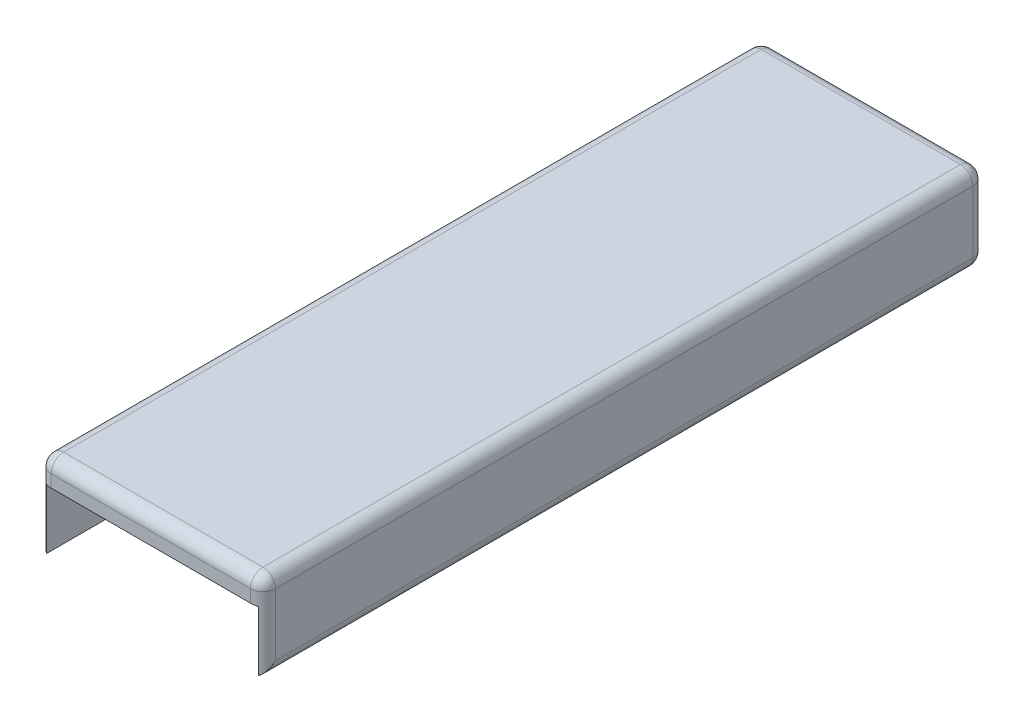
ISO-10303-21;
HEADER;
FILE_DESCRIPTION(('STEP AP214'),'2;1');
FILE_NAME('part.step','',(''),(''),'','','');
FILE_SCHEMA(('AUTOMOTIVE_DESIGN { 1 0 10303 214 1 1 1 1 }'));
ENDSEC;
DATA;
#1=APPLICATION_CONTEXT('core data for automotive mechanical design processes');
#2=APPLICATION_PROTOCOL_DEFINITION('international standard','automotive_design',2000,#1);
#3=PRODUCT_CONTEXT('',#1,'mechanical');
#4=PRODUCT('Part','Part','',(#3));
#5=PRODUCT_RELATED_PRODUCT_CATEGORY('part','',(#4));
#6=PRODUCT_DEFINITION_FORMATION('','',#4);
#7=PRODUCT_DEFINITION_CONTEXT('part definition',#1,'design');
#8=PRODUCT_DEFINITION('design','',#6,#7);
#9=PRODUCT_DEFINITION_SHAPE('','',#8);
#10=(LENGTH_UNIT() NAMED_UNIT(*) SI_UNIT(.MILLI.,.METRE.));
#11=(NAMED_UNIT(*) PLANE_ANGLE_UNIT() SI_UNIT($,.RADIAN.));
#12=(NAMED_UNIT(*) SI_UNIT($,.STERADIAN.) SOLID_ANGLE_UNIT());
#13=UNCERTAINTY_MEASURE_WITH_UNIT(LENGTH_MEASURE(1.E-05),#10,'distance_accuracy_value','');
#14=(GEOMETRIC_REPRESENTATION_CONTEXT(3) GLOBAL_UNCERTAINTY_ASSIGNED_CONTEXT((#13)) GLOBAL_UNIT_ASSIGNED_CONTEXT((#10,
#11,#12)) REPRESENTATION_CONTEXT('',''));
#15=CARTESIAN_POINT('',(0.,0.,0.));
#16=DIRECTION('',(0.,0.,1.));
#17=DIRECTION('',(1.,0.,0.));
#18=AXIS2_PLACEMENT_3D('',#15,#16,#17);
#19=CARTESIAN_POINT('',(-8.5,21.8847763108502,22.));
#20=DIRECTION('',(0.,0.,-1.));
#21=DIRECTION('',(-1.,0.,0.));
#22=AXIS2_PLACEMENT_3D('',#19,#20,#21);
#23=PLANE('',#22);
#24=DIRECTION('',(0.,1.,0.));
#25=VECTOR('',#24,1.);
#26=CARTESIAN_POINT('',(0.,-3.5,22.));
#27=LINE('',#26,#25);
#28=CARTESIAN_POINT('',(0.,-3.5,22.));
#29=VERTEX_POINT('',#28);
#30=CARTESIAN_POINT('',(0.,-1.49999999999999,22.));
#31=VERTEX_POINT('',#30);
#32=EDGE_CURVE('E64',#29,#31,#27,.T.);
#33=ORIENTED_EDGE('',*,*,#32,.F.);
#34=DIRECTION('',(1.,0.,0.));
#35=VECTOR('',#34,1.);
#36=CARTESIAN_POINT('',(-8.5,-3.5,22.));
#37=LINE('',#36,#35);
#38=CARTESIAN_POINT('',(8.,-3.5,22.));
#39=VERTEX_POINT('',#38);
#40=EDGE_CURVE('E224',#29,#39,#37,.T.);
#41=ORIENTED_EDGE('',*,*,#40,.T.);
#42=CARTESIAN_POINT('',(8.,-2.5,22.));
#43=DIRECTION('',(0.,0.,-1.));
#44=DIRECTION('',(-1.,0.,0.));
#45=AXIS2_PLACEMENT_3D('',#42,#43,#44);
#46=CIRCLE('',#45,1.);
#47=CARTESIAN_POINT('',(8.5,-3.36602540378444,22.));
#48=VERTEX_POINT('',#47);
#49=EDGE_CURVE('E277',#39,#48,#46,.F.);
#50=ORIENTED_EDGE('',*,*,#49,.T.);
#51=DIRECTION('',(0.,-1.,0.));
#52=VECTOR('',#51,1.);
#53=CARTESIAN_POINT('',(8.5,21.8847763108502,22.));
#54=LINE('',#53,#52);
#55=CARTESIAN_POINT('',(8.5,-1.49999999999999,22.));
#56=VERTEX_POINT('',#55);
#57=EDGE_CURVE('E223',#56,#48,#54,.T.);
#58=ORIENTED_EDGE('',*,*,#57,.F.);
#59=DIRECTION('',(-1.,0.,0.));
#60=VECTOR('',#59,1.);
#61=CARTESIAN_POINT('',(-8.5,-1.49999999999999,22.));
#62=LINE('',#61,#60);
#63=EDGE_CURVE('E222',#56,#31,#62,.T.);
#64=ORIENTED_EDGE('',*,*,#63,.T.);
#65=EDGE_LOOP('',(#33,#41,#50,#58,#64));
#66=FACE_BOUND('',#65,.T.);
#67=ADVANCED_FACE('F49',(#66),#23,.F.);
#68=CARTESIAN_POINT('',(-8.5,-1.49999999999999,22.));
#69=DIRECTION('',(0.,0.919145030018057,-0.39391929857917));
#70=DIRECTION('',(-1.,0.,0.));
#71=AXIS2_PLACEMENT_3D('',#68,#69,#70);
#72=PLANE('',#71);
#73=DIRECTION('',(0.,0.39391929857917,0.919145030018057));
#74=VECTOR('',#73,1.);
#75=CARTESIAN_POINT('',(0.,-1.49999999999999,22.));
#76=LINE('',#75,#74);
#77=CARTESIAN_POINT('',(0.,-1.45714285714285,22.1));
#78=VERTEX_POINT('',#77);
#79=EDGE_CURVE('E12',#31,#78,#76,.T.);
#80=ORIENTED_EDGE('',*,*,#79,.F.);
#81=ORIENTED_EDGE('',*,*,#63,.F.);
#82=DIRECTION('',(0.,-0.39391929857917,-0.919145030018057));
#83=VECTOR('',#82,1.);
#84=CARTESIAN_POINT('',(8.5,-1.5,22.));
#85=LINE('',#84,#83);
#86=CARTESIAN_POINT('',(8.5,1.44258231590764,28.8660254037844));
#87=VERTEX_POINT('',#86);
#88=EDGE_CURVE('E232',#87,#56,#85,.T.);
#89=ORIENTED_EDGE('',*,*,#88,.F.);
#90=CARTESIAN_POINT('',(8.,1.0714285714286,28.));
#91=DIRECTION('',(0.,0.919145030018057,-0.39391929857917));
#92=DIRECTION('',(0.,-0.39391929857917,-0.919145030018057));
#93=AXIS2_PLACEMENT_3D('',#90,#91,#92);
#94=ELLIPSE('',#93,1.08796758655199,1.);
#95=CARTESIAN_POINT('',(8.,1.5,29.));
#96=VERTEX_POINT('',#95);
#97=EDGE_CURVE('E266',#87,#96,#94,.F.);
#98=ORIENTED_EDGE('',*,*,#97,.T.);
#99=DIRECTION('',(1.,0.,0.));
#100=VECTOR('',#99,1.);
#101=CARTESIAN_POINT('',(-8.5,1.5,29.));
#102=LINE('',#101,#100);
#103=CARTESIAN_POINT('',(-8.,1.5,29.));
#104=VERTEX_POINT('',#103);
#105=EDGE_CURVE('E219',#104,#96,#102,.T.);
#106=ORIENTED_EDGE('',*,*,#105,.F.);
#107=CARTESIAN_POINT('',(-8.,1.0714285714286,28.));
#108=DIRECTION('',(0.,0.919145030018057,-0.39391929857917));
#109=DIRECTION('',(0.,-0.39391929857917,-0.919145030018057));
#110=AXIS2_PLACEMENT_3D('',#107,#108,#109);
#111=ELLIPSE('',#110,1.08796758655199,1.);
#112=CARTESIAN_POINT('',(-8.5,1.44258231590764,28.8660254037844));
#113=VERTEX_POINT('',#112);
#114=EDGE_CURVE('E268',#104,#113,#111,.F.);
#115=ORIENTED_EDGE('',*,*,#114,.T.);
#116=DIRECTION('',(0.,0.39391929857917,0.919145030018057));
#117=VECTOR('',#116,1.);
#118=CARTESIAN_POINT('',(-8.5,-1.49999999999999,22.));
#119=LINE('',#118,#117);
#120=CARTESIAN_POINT('',(-8.5,-1.45714285714285,22.1));
#121=VERTEX_POINT('',#120);
#122=EDGE_CURVE('E230',#121,#113,#119,.T.);
#123=ORIENTED_EDGE('',*,*,#122,.F.);
#124=DIRECTION('',(1.,0.,0.));
#125=VECTOR('',#124,1.);
#126=CARTESIAN_POINT('',(-8.5,-1.45714285714285,22.1));
#127=LINE('',#126,#125);
#128=EDGE_CURVE('E72',#121,#78,#127,.T.);
#129=ORIENTED_EDGE('',*,*,#128,.T.);
#130=EDGE_LOOP('',(#80,#81,#89,#98,#106,#115,#123,#129));
#131=FACE_BOUND('',#130,.T.);
#132=ADVANCED_FACE('F410',(#131),#72,.F.);
#133=CARTESIAN_POINT('',(9.,3.5,29.));
#134=DIRECTION('',(-1.,0.,0.));
#135=DIRECTION('',(0.,0.,1.));
#136=AXIS2_PLACEMENT_3D('',#133,#134,#135);
#137=PLANE('',#136);
#138=DIRECTION('',(0.,0.,-1.));
#139=VECTOR('',#138,1.);
#140=CARTESIAN_POINT('',(9.,2.5,29.));
#141=LINE('',#140,#139);
#142=CARTESIAN_POINT('',(9.,2.5,-28.));
#143=VERTEX_POINT('',#142);
#144=CARTESIAN_POINT('',(9.,2.5,28.));
#145=VERTEX_POINT('',#144);
#146=EDGE_CURVE('E295',#143,#145,#141,.F.);
#147=ORIENTED_EDGE('',*,*,#146,.T.);
#148=DIRECTION('',(0.,-1.,0.));
#149=VECTOR('',#148,1.);
#150=CARTESIAN_POINT('',(9.,3.5,28.));
#151=LINE('',#150,#149);
#152=CARTESIAN_POINT('',(9.,-2.5,28.));
#153=VERTEX_POINT('',#152);
#154=EDGE_CURVE('E297',#145,#153,#151,.T.);
#155=ORIENTED_EDGE('',*,*,#154,.T.);
#156=DIRECTION('',(0.,0.,-1.));
#157=VECTOR('',#156,1.);
#158=CARTESIAN_POINT('',(9.,-2.5,-29.));
#159=LINE('',#158,#157);
#160=CARTESIAN_POINT('',(9.,-2.5,-28.));
#161=VERTEX_POINT('',#160);
#162=EDGE_CURVE('E291',#153,#161,#159,.T.);
#163=ORIENTED_EDGE('',*,*,#162,.T.);
#164=DIRECTION('',(0.,-1.,0.));
#165=VECTOR('',#164,1.);
#166=CARTESIAN_POINT('',(9.,3.5,-28.));
#167=LINE('',#166,#165);
#168=EDGE_CURVE('E293',#161,#143,#167,.F.);
#169=ORIENTED_EDGE('',*,*,#168,.T.);
#170=EDGE_LOOP('',(#147,#155,#163,#169));
#171=FACE_BOUND('',#170,.T.);
#172=ADVANCED_FACE('F372',(#171),#137,.F.);
#173=CARTESIAN_POINT('',(-9.,3.5,-29.));
#174=DIRECTION('',(0.,0.,1.));
#175=DIRECTION('',(1.,0.,0.));
#176=AXIS2_PLACEMENT_3D('',#173,#174,#175);
#177=PLANE('',#176);
#178=DIRECTION('',(0.,-1.,0.));
#179=VECTOR('',#178,1.);
#180=CARTESIAN_POINT('',(8.,3.5,-29.));
#181=LINE('',#180,#179);
#182=CARTESIAN_POINT('',(8.,2.5,-29.));
#183=VERTEX_POINT('',#182);
#184=CARTESIAN_POINT('',(8.,-2.5,-29.));
#185=VERTEX_POINT('',#184);
#186=EDGE_CURVE('E234',#183,#185,#181,.T.);
#187=ORIENTED_EDGE('',*,*,#186,.T.);
#188=DIRECTION('',(-1.,0.,0.));
#189=VECTOR('',#188,1.);
#190=CARTESIAN_POINT('',(-9.,-2.5,-29.));
#191=LINE('',#190,#189);
#192=CARTESIAN_POINT('',(-8.,-2.5,-29.));
#193=VERTEX_POINT('',#192);
#194=EDGE_CURVE('E240',#185,#193,#191,.T.);
#195=ORIENTED_EDGE('',*,*,#194,.T.);
#196=DIRECTION('',(0.,-1.,0.));
#197=VECTOR('',#196,1.);
#198=CARTESIAN_POINT('',(-8.,3.5,-29.));
#199=LINE('',#198,#197);
#200=CARTESIAN_POINT('',(-8.,2.5,-29.));
#201=VERTEX_POINT('',#200);
#202=EDGE_CURVE('E238',#193,#201,#199,.F.);
#203=ORIENTED_EDGE('',*,*,#202,.T.);
#204=DIRECTION('',(-1.,0.,0.));
#205=VECTOR('',#204,1.);
#206=CARTESIAN_POINT('',(-9.,2.5,-29.));
#207=LINE('',#206,#205);
#208=EDGE_CURVE('E236',#201,#183,#207,.F.);
#209=ORIENTED_EDGE('',*,*,#208,.T.);
#210=EDGE_LOOP('',(#187,#195,#203,#209));
#211=FACE_BOUND('',#210,.T.);
#212=ADVANCED_FACE('F462',(#211),#177,.F.);
#213=CARTESIAN_POINT('',(-9.,3.5,29.));
#214=DIRECTION('',(1.,0.,0.));
#215=DIRECTION('',(0.,0.,-1.));
#216=AXIS2_PLACEMENT_3D('',#213,#214,#215);
#217=PLANE('',#216);
#218=DIRECTION('',(0.,-1.,0.));
#219=VECTOR('',#218,1.);
#220=CARTESIAN_POINT('',(-9.,3.5,-28.));
#221=LINE('',#220,#219);
#222=CARTESIAN_POINT('',(-9.,2.5,-28.));
#223=VERTEX_POINT('',#222);
#224=CARTESIAN_POINT('',(-9.,-2.5,-28.));
#225=VERTEX_POINT('',#224);
#226=EDGE_CURVE('E255',#223,#225,#221,.T.);
#227=ORIENTED_EDGE('',*,*,#226,.T.);
#228=DIRECTION('',(0.,0.,1.));
#229=VECTOR('',#228,1.);
#230=CARTESIAN_POINT('',(-9.,-2.5,29.));
#231=LINE('',#230,#229);
#232=CARTESIAN_POINT('',(-9.,-2.5,28.));
#233=VERTEX_POINT('',#232);
#234=EDGE_CURVE('E258',#225,#233,#231,.T.);
#235=ORIENTED_EDGE('',*,*,#234,.T.);
#236=DIRECTION('',(0.,-1.,0.));
#237=VECTOR('',#236,1.);
#238=CARTESIAN_POINT('',(-9.,3.5,28.));
#239=LINE('',#238,#237);
#240=CARTESIAN_POINT('',(-9.,2.5,28.));
#241=VERTEX_POINT('',#240);
#242=EDGE_CURVE('E253',#233,#241,#239,.F.);
#243=ORIENTED_EDGE('',*,*,#242,.T.);
#244=DIRECTION('',(0.,0.,1.));
#245=VECTOR('',#244,1.);
#246=CARTESIAN_POINT('',(-9.,2.5,29.));
#247=LINE('',#246,#245);
#248=EDGE_CURVE('E251',#241,#223,#247,.F.);
#249=ORIENTED_EDGE('',*,*,#248,.T.);
#250=EDGE_LOOP('',(#227,#235,#243,#249));
#251=FACE_BOUND('',#250,.T.);
#252=ADVANCED_FACE('F459',(#251),#217,.F.);
#253=CARTESIAN_POINT('',(-9.,3.5,29.));
#254=DIRECTION('',(0.,0.,-1.));
#255=DIRECTION('',(-1.,0.,0.));
#256=AXIS2_PLACEMENT_3D('',#253,#254,#255);
#257=PLANE('',#256);
#258=DIRECTION('',(1.,0.,0.));
#259=VECTOR('',#258,1.);
#260=CARTESIAN_POINT('',(-9.,2.5,29.));
#261=LINE('',#260,#259);
#262=CARTESIAN_POINT('',(8.,2.5,29.));
#263=VERTEX_POINT('',#262);
#264=CARTESIAN_POINT('',(-8.,2.5,29.));
#265=VERTEX_POINT('',#264);
#266=EDGE_CURVE('E262',#263,#265,#261,.F.);
#267=ORIENTED_EDGE('',*,*,#266,.T.);
#268=DIRECTION('',(0.,-1.,0.));
#269=VECTOR('',#268,1.);
#270=CARTESIAN_POINT('',(-8.,3.5,29.));
#271=LINE('',#270,#269);
#272=EDGE_CURVE('E264',#265,#104,#271,.T.);
#273=ORIENTED_EDGE('',*,*,#272,.T.);
#274=ORIENTED_EDGE('',*,*,#105,.T.);
#275=DIRECTION('',(0.,-1.,0.));
#276=VECTOR('',#275,1.);
#277=CARTESIAN_POINT('',(8.,3.5,29.));
#278=LINE('',#277,#276);
#279=EDGE_CURVE('E260',#96,#263,#278,.F.);
#280=ORIENTED_EDGE('',*,*,#279,.T.);
#281=EDGE_LOOP('',(#267,#273,#274,#280));
#282=FACE_BOUND('',#281,.T.);
#283=ADVANCED_FACE('F409',(#282),#257,.F.);
#284=CARTESIAN_POINT('',(0.,3.5,0.));
#285=DIRECTION('',(0.,-1.,0.));
#286=DIRECTION('',(0.,0.,-1.));
#287=AXIS2_PLACEMENT_3D('',#284,#285,#286);
#288=PLANE('',#287);
#289=DIRECTION('',(0.,0.,1.));
#290=VECTOR('',#289,1.);
#291=CARTESIAN_POINT('',(-8.,3.5,0.));
#292=LINE('',#291,#290);
#293=CARTESIAN_POINT('',(-8.,3.5,-28.));
#294=VERTEX_POINT('',#293);
#295=CARTESIAN_POINT('',(-8.,3.5,28.));
#296=VERTEX_POINT('',#295);
#297=EDGE_CURVE('E286',#294,#296,#292,.T.);
#298=ORIENTED_EDGE('',*,*,#297,.T.);
#299=DIRECTION('',(1.,0.,0.));
#300=VECTOR('',#299,1.);
#301=CARTESIAN_POINT('',(0.,3.5,28.));
#302=LINE('',#301,#300);
#303=CARTESIAN_POINT('',(8.,3.5,28.));
#304=VERTEX_POINT('',#303);
#305=EDGE_CURVE('E288',#296,#304,#302,.T.);
#306=ORIENTED_EDGE('',*,*,#305,.T.);
#307=DIRECTION('',(0.,0.,-1.));
#308=VECTOR('',#307,1.);
#309=CARTESIAN_POINT('',(8.,3.5,0.));
#310=LINE('',#309,#308);
#311=CARTESIAN_POINT('',(8.,3.5,-28.));
#312=VERTEX_POINT('',#311);
#313=EDGE_CURVE('E282',#304,#312,#310,.T.);
#314=ORIENTED_EDGE('',*,*,#313,.T.);
#315=DIRECTION('',(-1.,0.,0.));
#316=VECTOR('',#315,1.);
#317=CARTESIAN_POINT('',(0.,3.5,-28.));
#318=LINE('',#317,#316);
#319=EDGE_CURVE('E284',#312,#294,#318,.T.);
#320=ORIENTED_EDGE('',*,*,#319,.T.);
#321=EDGE_LOOP('',(#298,#306,#314,#320));
#322=FACE_BOUND('',#321,.T.);
#323=ADVANCED_FACE('F380',(#322),#288,.F.);
#324=CARTESIAN_POINT('',(0.,-3.5,0.));
#325=DIRECTION('',(0.,-1.,0.));
#326=DIRECTION('',(0.,0.,-1.));
#327=AXIS2_PLACEMENT_3D('',#324,#325,#326);
#328=PLANE('',#327);
#329=ORIENTED_EDGE('',*,*,#40,.F.);
#330=DIRECTION('',(0.,0.,-1.));
#331=VECTOR('',#330,1.);
#332=CARTESIAN_POINT('',(0.,-3.5,22.1));
#333=LINE('',#332,#331);
#334=CARTESIAN_POINT('',(0.,-3.5,22.1));
#335=VERTEX_POINT('',#334);
#336=EDGE_CURVE('E204',#335,#29,#333,.T.);
#337=ORIENTED_EDGE('',*,*,#336,.F.);
#338=DIRECTION('',(1.,0.,0.));
#339=VECTOR('',#338,1.);
#340=CARTESIAN_POINT('',(0.,-3.5,22.1));
#341=LINE('',#340,#339);
#342=CARTESIAN_POINT('',(-8.5,-3.5,22.1));
#343=VERTEX_POINT('',#342);
#344=EDGE_CURVE('E189',#343,#335,#341,.T.);
#345=ORIENTED_EDGE('',*,*,#344,.F.);
#346=DIRECTION('',(0.,0.,-1.));
#347=VECTOR('',#346,1.);
#348=CARTESIAN_POINT('',(-8.5,-3.5,22.1));
#349=LINE('',#348,#347);
#350=CARTESIAN_POINT('',(-8.5,-3.5,22.));
#351=VERTEX_POINT('',#350);
#352=EDGE_CURVE('E197',#343,#351,#349,.T.);
#353=ORIENTED_EDGE('',*,*,#352,.T.);
#354=DIRECTION('',(1.,0.,0.));
#355=VECTOR('',#354,1.);
#356=CARTESIAN_POINT('',(0.,-3.5,22.));
#357=LINE('',#356,#355);
#358=CARTESIAN_POINT('',(-8.,-3.5,22.));
#359=VERTEX_POINT('',#358);
#360=EDGE_CURVE('E215',#351,#359,#357,.T.);
#361=ORIENTED_EDGE('',*,*,#360,.T.);
#362=DIRECTION('',(0.,0.,1.));
#363=VECTOR('',#362,1.);
#364=CARTESIAN_POINT('',(-8.,-3.5,-29.));
#365=LINE('',#364,#363);
#366=CARTESIAN_POINT('',(-8.,-3.5,-28.));
#367=VERTEX_POINT('',#366);
#368=EDGE_CURVE('E249',#359,#367,#365,.F.);
#369=ORIENTED_EDGE('',*,*,#368,.T.);
#370=DIRECTION('',(-1.,0.,0.));
#371=VECTOR('',#370,1.);
#372=CARTESIAN_POINT('',(9.,-3.5,-28.));
#373=LINE('',#372,#371);
#374=CARTESIAN_POINT('',(8.,-3.5,-28.));
#375=VERTEX_POINT('',#374);
#376=EDGE_CURVE('E246',#367,#375,#373,.F.);
#377=ORIENTED_EDGE('',*,*,#376,.T.);
#378=DIRECTION('',(0.,0.,-1.));
#379=VECTOR('',#378,1.);
#380=CARTESIAN_POINT('',(8.,-3.5,29.));
#381=LINE('',#380,#379);
#382=EDGE_CURVE('E243',#375,#39,#381,.F.);
#383=ORIENTED_EDGE('',*,*,#382,.T.);
#384=EDGE_LOOP('',(#329,#337,#345,#353,#361,#369,#377,#383));
#385=FACE_BOUND('',#384,.T.);
#386=ADVANCED_FACE('F206',(#385),#328,.T.);
#387=CARTESIAN_POINT('',(-8.5,21.8847763108502,29.));
#388=DIRECTION('',(-1.,0.,0.));
#389=DIRECTION('',(0.,0.,1.));
#390=AXIS2_PLACEMENT_3D('',#387,#388,#389);
#391=PLANE('',#390);
#392=DIRECTION('',(0.,0.,-1.));
#393=VECTOR('',#392,1.);
#394=CARTESIAN_POINT('',(-8.5,-3.36602540378444,28.8660254037844));
#395=LINE('',#394,#393);
#396=CARTESIAN_POINT('',(-8.5,-3.36602540378444,28.8660254037844));
#397=VERTEX_POINT('',#396);
#398=CARTESIAN_POINT('',(-8.5,-3.36602540378444,22.1));
#399=VERTEX_POINT('',#398);
#400=EDGE_CURVE('E272',#397,#399,#395,.T.);
#401=ORIENTED_EDGE('',*,*,#400,.T.);
#402=DIRECTION('',(0.,-1.,0.));
#403=VECTOR('',#402,1.);
#404=CARTESIAN_POINT('',(-8.5,-3.5,22.1));
#405=LINE('',#404,#403);
#406=EDGE_CURVE('E191',#121,#399,#405,.T.);
#407=ORIENTED_EDGE('',*,*,#406,.F.);
#408=ORIENTED_EDGE('',*,*,#122,.T.);
#409=DIRECTION('',(0.,-1.,0.));
#410=VECTOR('',#409,1.);
#411=CARTESIAN_POINT('',(-8.5,1.44258231590764,28.8660254037844));
#412=LINE('',#411,#410);
#413=EDGE_CURVE('E275',#113,#397,#412,.T.);
#414=ORIENTED_EDGE('',*,*,#413,.T.);
#415=EDGE_LOOP('',(#401,#407,#408,#414));
#416=FACE_BOUND('',#415,.T.);
#417=ADVANCED_FACE('F449',(#416),#391,.F.);
#418=CARTESIAN_POINT('',(8.5,21.8847763108502,29.));
#419=DIRECTION('',(1.,0.,0.));
#420=DIRECTION('',(0.,0.,-1.));
#421=AXIS2_PLACEMENT_3D('',#418,#419,#420);
#422=PLANE('',#421);
#423=DIRECTION('',(0.,0.,1.));
#424=VECTOR('',#423,1.);
#425=CARTESIAN_POINT('',(8.5,-3.36602540378444,22.));
#426=LINE('',#425,#424);
#427=CARTESIAN_POINT('',(8.5,-3.36602540378444,28.8660254037844));
#428=VERTEX_POINT('',#427);
#429=EDGE_CURVE('E300',#48,#428,#426,.T.);
#430=ORIENTED_EDGE('',*,*,#429,.T.);
#431=DIRECTION('',(0.,-1.,0.));
#432=VECTOR('',#431,1.);
#433=CARTESIAN_POINT('',(8.5,-3.36602540378444,28.8660254037844));
#434=LINE('',#433,#432);
#435=EDGE_CURVE('E57',#428,#87,#434,.F.);
#436=ORIENTED_EDGE('',*,*,#435,.T.);
#437=ORIENTED_EDGE('',*,*,#88,.T.);
#438=ORIENTED_EDGE('',*,*,#57,.T.);
#439=EDGE_LOOP('',(#430,#436,#437,#438));
#440=FACE_BOUND('',#439,.T.);
#441=ADVANCED_FACE('F447',(#440),#422,.F.);
#442=CARTESIAN_POINT('',(0.,2.5,28.));
#443=DIRECTION('',(1.,0.,0.));
#444=DIRECTION('',(0.,0.,-1.));
#445=AXIS2_PLACEMENT_3D('',#442,#443,#444);
#446=CYLINDRICAL_SURFACE('',#445,1.);
#447=CARTESIAN_POINT('',(8.,2.5,28.));
#448=DIRECTION('',(1.,0.,0.));
#449=DIRECTION('',(0.,0.,-1.));
#450=AXIS2_PLACEMENT_3D('',#447,#448,#449);
#451=CIRCLE('',#450,1.);
#452=EDGE_CURVE('E226',#304,#263,#451,.T.);
#453=ORIENTED_EDGE('',*,*,#452,.F.);
#454=ORIENTED_EDGE('',*,*,#305,.F.);
#455=CARTESIAN_POINT('',(-8.,2.5,28.));
#456=DIRECTION('',(-1.,0.,0.));
#457=DIRECTION('',(0.,0.,1.));
#458=AXIS2_PLACEMENT_3D('',#455,#456,#457);
#459=CIRCLE('',#458,1.);
#460=EDGE_CURVE('E347',#265,#296,#459,.T.);
#461=ORIENTED_EDGE('',*,*,#460,.F.);
#462=ORIENTED_EDGE('',*,*,#266,.F.);
#463=EDGE_LOOP('',(#453,#454,#461,#462));
#464=FACE_BOUND('',#463,.T.);
#465=ADVANCED_FACE('F51',(#464),#446,.T.);
#466=CARTESIAN_POINT('',(8.,2.5,28.));
#467=DIRECTION('',(0.,1.,0.));
#468=DIRECTION('',(0.,0.,1.));
#469=AXIS2_PLACEMENT_3D('',#466,#467,#468);
#470=SPHERICAL_SURFACE('',#469,1.);
#471=CARTESIAN_POINT('',(8.,2.5,28.));
#472=DIRECTION('',(0.,1.,0.));
#473=DIRECTION('',(0.,0.,1.));
#474=AXIS2_PLACEMENT_3D('',#471,#472,#473);
#475=CIRCLE('',#474,1.);
#476=EDGE_CURVE('E344',#145,#263,#475,.F.);
#477=ORIENTED_EDGE('',*,*,#476,.F.);
#478=CARTESIAN_POINT('',(8.,2.5,28.));
#479=DIRECTION('',(0.,0.,1.));
#480=DIRECTION('',(1.,0.,0.));
#481=AXIS2_PLACEMENT_3D('',#478,#479,#480);
#482=CIRCLE('',#481,1.);
#483=EDGE_CURVE('E353',#304,#145,#482,.F.);
#484=ORIENTED_EDGE('',*,*,#483,.F.);
#485=ORIENTED_EDGE('',*,*,#452,.T.);
#486=EDGE_LOOP('',(#477,#484,#485));
#487=FACE_BOUND('',#486,.T.);
#488=ADVANCED_FACE('F360',(#487),#470,.T.);
#489=CARTESIAN_POINT('',(8.,2.5,0.));
#490=DIRECTION('',(0.,0.,-1.));
#491=DIRECTION('',(-1.,0.,0.));
#492=AXIS2_PLACEMENT_3D('',#489,#490,#491);
#493=CYLINDRICAL_SURFACE('',#492,1.);
#494=ORIENTED_EDGE('',*,*,#483,.T.);
#495=ORIENTED_EDGE('',*,*,#146,.F.);
#496=CARTESIAN_POINT('',(8.,2.5,-28.));
#497=DIRECTION('',(0.,0.,-1.));
#498=DIRECTION('',(-1.,0.,0.));
#499=AXIS2_PLACEMENT_3D('',#496,#497,#498);
#500=CIRCLE('',#499,1.);
#501=EDGE_CURVE('E341',#312,#143,#500,.T.);
#502=ORIENTED_EDGE('',*,*,#501,.F.);
#503=ORIENTED_EDGE('',*,*,#313,.F.);
#504=EDGE_LOOP('',(#494,#495,#502,#503));
#505=FACE_BOUND('',#504,.T.);
#506=ADVANCED_FACE('F377',(#505),#493,.T.);
#507=CARTESIAN_POINT('',(0.,2.5,-28.));
#508=DIRECTION('',(-1.,0.,0.));
#509=DIRECTION('',(0.,0.,1.));
#510=AXIS2_PLACEMENT_3D('',#507,#508,#509);
#511=CYLINDRICAL_SURFACE('',#510,1.);
#512=CARTESIAN_POINT('',(-8.,2.5,-28.));
#513=DIRECTION('',(-1.,0.,0.));
#514=DIRECTION('',(0.,0.,1.));
#515=AXIS2_PLACEMENT_3D('',#512,#513,#514);
#516=CIRCLE('',#515,1.);
#517=EDGE_CURVE('E335',#294,#201,#516,.T.);
#518=ORIENTED_EDGE('',*,*,#517,.F.);
#519=ORIENTED_EDGE('',*,*,#319,.F.);
#520=CARTESIAN_POINT('',(8.,2.5,-28.));
#521=DIRECTION('',(1.,0.,0.));
#522=DIRECTION('',(0.,1.,0.));
#523=AXIS2_PLACEMENT_3D('',#520,#521,#522);
#524=CIRCLE('',#523,1.);
#525=EDGE_CURVE('E338',#183,#312,#524,.T.);
#526=ORIENTED_EDGE('',*,*,#525,.F.);
#527=ORIENTED_EDGE('',*,*,#208,.F.);
#528=EDGE_LOOP('',(#518,#519,#526,#527));
#529=FACE_BOUND('',#528,.T.);
#530=ADVANCED_FACE('F385',(#529),#511,.T.);
#531=CARTESIAN_POINT('',(-8.,2.5,0.));
#532=DIRECTION('',(0.,0.,1.));
#533=DIRECTION('',(1.,0.,0.));
#534=AXIS2_PLACEMENT_3D('',#531,#532,#533);
#535=CYLINDRICAL_SURFACE('',#534,1.);
#536=CARTESIAN_POINT('',(-8.,2.5,28.));
#537=DIRECTION('',(0.,0.,1.));
#538=DIRECTION('',(1.,0.,0.));
#539=AXIS2_PLACEMENT_3D('',#536,#537,#538);
#540=CIRCLE('',#539,1.);
#541=EDGE_CURVE('E350',#296,#241,#540,.T.);
#542=ORIENTED_EDGE('',*,*,#541,.F.);
#543=ORIENTED_EDGE('',*,*,#297,.F.);
#544=CARTESIAN_POINT('',(-8.,2.5,-28.));
#545=DIRECTION('',(0.,0.,-1.));
#546=DIRECTION('',(-1.,0.,0.));
#547=AXIS2_PLACEMENT_3D('',#544,#545,#546);
#548=CIRCLE('',#547,1.);
#549=EDGE_CURVE('E332',#223,#294,#548,.T.);
#550=ORIENTED_EDGE('',*,*,#549,.F.);
#551=ORIENTED_EDGE('',*,*,#248,.F.);
#552=EDGE_LOOP('',(#542,#543,#550,#551));
#553=FACE_BOUND('',#552,.T.);
#554=ADVANCED_FACE('F396',(#553),#535,.T.);
#555=CARTESIAN_POINT('',(-8.,2.5,28.));
#556=DIRECTION('',(0.,1.,0.));
#557=DIRECTION('',(0.,0.,1.));
#558=AXIS2_PLACEMENT_3D('',#555,#556,#557);
#559=SPHERICAL_SURFACE('',#558,1.);
#560=ORIENTED_EDGE('',*,*,#460,.T.);
#561=ORIENTED_EDGE('',*,*,#541,.T.);
#562=CARTESIAN_POINT('',(-8.,2.5,28.));
#563=DIRECTION('',(0.,1.,0.));
#564=DIRECTION('',(0.,0.,1.));
#565=AXIS2_PLACEMENT_3D('',#562,#563,#564);
#566=CIRCLE('',#565,1.);
#567=EDGE_CURVE('E329',#265,#241,#566,.F.);
#568=ORIENTED_EDGE('',*,*,#567,.F.);
#569=EDGE_LOOP('',(#560,#561,#568));
#570=FACE_BOUND('',#569,.T.);
#571=ADVANCED_FACE('F401',(#570),#559,.T.);
#572=CARTESIAN_POINT('',(8.,3.5,28.));
#573=DIRECTION('',(0.,-1.,0.));
#574=DIRECTION('',(0.,0.,-1.));
#575=AXIS2_PLACEMENT_3D('',#572,#573,#574);
#576=CYLINDRICAL_SURFACE('',#575,1.);
#577=ORIENTED_EDGE('',*,*,#97,.F.);
#578=ORIENTED_EDGE('',*,*,#435,.F.);
#579=CARTESIAN_POINT('',(8.,-2.5,28.));
#580=DIRECTION('',(0.,0.707106781186547,0.707106781186547));
#581=DIRECTION('',(0.,-0.707106781186547,0.707106781186547));
#582=AXIS2_PLACEMENT_3D('',#579,#580,#581);
#583=ELLIPSE('',#582,1.41421356237309,1.);
#584=EDGE_CURVE('E326',#153,#428,#583,.F.);
#585=ORIENTED_EDGE('',*,*,#584,.F.);
#586=ORIENTED_EDGE('',*,*,#154,.F.);
#587=ORIENTED_EDGE('',*,*,#476,.T.);
#588=ORIENTED_EDGE('',*,*,#279,.F.);
#589=EDGE_LOOP('',(#577,#578,#585,#586,#587,#588));
#590=FACE_BOUND('',#589,.T.);
#591=ADVANCED_FACE('F368',(#590),#576,.T.);
#592=CARTESIAN_POINT('',(8.,2.5,-28.));
#593=DIRECTION('',(0.,1.,0.));
#594=DIRECTION('',(0.,0.,1.));
#595=AXIS2_PLACEMENT_3D('',#592,#593,#594);
#596=SPHERICAL_SURFACE('',#595,1.);
#597=ORIENTED_EDGE('',*,*,#525,.T.);
#598=ORIENTED_EDGE('',*,*,#501,.T.);
#599=CARTESIAN_POINT('',(8.,2.5,-28.));
#600=DIRECTION('',(0.,1.,0.));
#601=DIRECTION('',(0.,0.,1.));
#602=AXIS2_PLACEMENT_3D('',#599,#600,#601);
#603=CIRCLE('',#602,1.);
#604=EDGE_CURVE('E323',#183,#143,#603,.F.);
#605=ORIENTED_EDGE('',*,*,#604,.F.);
#606=EDGE_LOOP('',(#597,#598,#605));
#607=FACE_BOUND('',#606,.T.);
#608=ADVANCED_FACE('F429',(#607),#596,.T.);
#609=CARTESIAN_POINT('',(-8.,2.5,-28.));
#610=DIRECTION('',(0.,1.,0.));
#611=DIRECTION('',(0.,0.,1.));
#612=AXIS2_PLACEMENT_3D('',#609,#610,#611);
#613=SPHERICAL_SURFACE('',#612,1.);
#614=ORIENTED_EDGE('',*,*,#549,.T.);
#615=ORIENTED_EDGE('',*,*,#517,.T.);
#616=CARTESIAN_POINT('',(-8.,2.5,-28.));
#617=DIRECTION('',(0.,1.,0.));
#618=DIRECTION('',(0.,0.,1.));
#619=AXIS2_PLACEMENT_3D('',#616,#617,#618);
#620=CIRCLE('',#619,1.);
#621=EDGE_CURVE('E320',#223,#201,#620,.F.);
#622=ORIENTED_EDGE('',*,*,#621,.F.);
#623=EDGE_LOOP('',(#614,#615,#622));
#624=FACE_BOUND('',#623,.T.);
#625=ADVANCED_FACE('F391',(#624),#613,.T.);
#626=CARTESIAN_POINT('',(-8.,3.5,28.));
#627=DIRECTION('',(0.,-1.,0.));
#628=DIRECTION('',(0.,0.,-1.));
#629=AXIS2_PLACEMENT_3D('',#626,#627,#628);
#630=CYLINDRICAL_SURFACE('',#629,1.);
#631=ORIENTED_EDGE('',*,*,#567,.T.);
#632=ORIENTED_EDGE('',*,*,#242,.F.);
#633=CARTESIAN_POINT('',(-8.,-2.5,28.));
#634=DIRECTION('',(0.,-0.707106781186547,-0.707106781186547));
#635=DIRECTION('',(0.,0.707106781186547,-0.707106781186547));
#636=AXIS2_PLACEMENT_3D('',#633,#634,#635);
#637=ELLIPSE('',#636,1.41421356237309,1.);
#638=EDGE_CURVE('E317',#397,#233,#637,.T.);
#639=ORIENTED_EDGE('',*,*,#638,.F.);
#640=ORIENTED_EDGE('',*,*,#413,.F.);
#641=ORIENTED_EDGE('',*,*,#114,.F.);
#642=ORIENTED_EDGE('',*,*,#272,.F.);
#643=EDGE_LOOP('',(#631,#632,#639,#640,#641,#642));
#644=FACE_BOUND('',#643,.T.);
#645=ADVANCED_FACE('F405',(#644),#630,.T.);
#646=CARTESIAN_POINT('',(8.,-2.5,29.));
#647=DIRECTION('',(0.,0.,1.));
#648=DIRECTION('',(1.,0.,0.));
#649=AXIS2_PLACEMENT_3D('',#646,#647,#648);
#650=CYLINDRICAL_SURFACE('',#649,1.);
#651=ORIENTED_EDGE('',*,*,#49,.F.);
#652=ORIENTED_EDGE('',*,*,#382,.F.);
#653=CARTESIAN_POINT('',(8.,-2.5,-28.));
#654=DIRECTION('',(0.,0.,-1.));
#655=DIRECTION('',(-1.,0.,0.));
#656=AXIS2_PLACEMENT_3D('',#653,#654,#655);
#657=CIRCLE('',#656,1.);
#658=EDGE_CURVE('E314',#161,#375,#657,.T.);
#659=ORIENTED_EDGE('',*,*,#658,.F.);
#660=ORIENTED_EDGE('',*,*,#162,.F.);
#661=ORIENTED_EDGE('',*,*,#584,.T.);
#662=ORIENTED_EDGE('',*,*,#429,.F.);
#663=EDGE_LOOP('',(#651,#652,#659,#660,#661,#662));
#664=FACE_BOUND('',#663,.T.);
#665=ADVANCED_FACE('F417',(#664),#650,.T.);
#666=CARTESIAN_POINT('',(8.,3.5,-28.));
#667=DIRECTION('',(0.,-1.,0.));
#668=DIRECTION('',(0.,0.,-1.));
#669=AXIS2_PLACEMENT_3D('',#666,#667,#668);
#670=CYLINDRICAL_SURFACE('',#669,1.);
#671=ORIENTED_EDGE('',*,*,#604,.T.);
#672=ORIENTED_EDGE('',*,*,#168,.F.);
#673=CARTESIAN_POINT('',(8.,-2.5,-28.));
#674=DIRECTION('',(0.,-1.,0.));
#675=DIRECTION('',(0.,0.,-1.));
#676=AXIS2_PLACEMENT_3D('',#673,#674,#675);
#677=CIRCLE('',#676,1.);
#678=EDGE_CURVE('E311',#185,#161,#677,.T.);
#679=ORIENTED_EDGE('',*,*,#678,.F.);
#680=ORIENTED_EDGE('',*,*,#186,.F.);
#681=EDGE_LOOP('',(#671,#672,#679,#680));
#682=FACE_BOUND('',#681,.T.);
#683=ADVANCED_FACE('F427',(#682),#670,.T.);
#684=CARTESIAN_POINT('',(-8.,3.5,-28.));
#685=DIRECTION('',(0.,-1.,0.));
#686=DIRECTION('',(0.,0.,-1.));
#687=AXIS2_PLACEMENT_3D('',#684,#685,#686);
#688=CYLINDRICAL_SURFACE('',#687,1.);
#689=ORIENTED_EDGE('',*,*,#621,.T.);
#690=ORIENTED_EDGE('',*,*,#202,.F.);
#691=CARTESIAN_POINT('',(-8.,-2.5,-28.));
#692=DIRECTION('',(0.,-1.,0.));
#693=DIRECTION('',(0.,0.,-1.));
#694=AXIS2_PLACEMENT_3D('',#691,#692,#693);
#695=CIRCLE('',#694,1.);
#696=EDGE_CURVE('E308',#225,#193,#695,.T.);
#697=ORIENTED_EDGE('',*,*,#696,.F.);
#698=ORIENTED_EDGE('',*,*,#226,.F.);
#699=EDGE_LOOP('',(#689,#690,#697,#698));
#700=FACE_BOUND('',#699,.T.);
#701=ADVANCED_FACE('F485',(#700),#688,.T.);
#702=CARTESIAN_POINT('',(-8.,-2.5,29.));
#703=DIRECTION('',(0.,0.,-1.));
#704=DIRECTION('',(-1.,0.,0.));
#705=AXIS2_PLACEMENT_3D('',#702,#703,#704);
#706=CYLINDRICAL_SURFACE('',#705,1.);
#707=ORIENTED_EDGE('',*,*,#638,.T.);
#708=ORIENTED_EDGE('',*,*,#234,.F.);
#709=CARTESIAN_POINT('',(-8.,-2.5,-28.));
#710=DIRECTION('',(0.,0.,-1.));
#711=DIRECTION('',(-1.,0.,0.));
#712=AXIS2_PLACEMENT_3D('',#709,#710,#711);
#713=CIRCLE('',#712,1.);
#714=EDGE_CURVE('E306',#367,#225,#713,.T.);
#715=ORIENTED_EDGE('',*,*,#714,.F.);
#716=ORIENTED_EDGE('',*,*,#368,.F.);
#717=CARTESIAN_POINT('',(-8.,-2.5,22.));
#718=DIRECTION('',(0.,0.,-1.));
#719=DIRECTION('',(-1.,0.,0.));
#720=AXIS2_PLACEMENT_3D('',#717,#718,#719);
#721=CIRCLE('',#720,1.);
#722=CARTESIAN_POINT('',(-8.5,-3.36602540378444,22.));
#723=VERTEX_POINT('',#722);
#724=EDGE_CURVE('E279',#723,#359,#721,.F.);
#725=ORIENTED_EDGE('',*,*,#724,.F.);
#726=EDGE_CURVE('E271',#399,#723,#395,.T.);
#727=ORIENTED_EDGE('',*,*,#726,.F.);
#728=ORIENTED_EDGE('',*,*,#400,.F.);
#729=EDGE_LOOP('',(#707,#708,#715,#716,#725,#727,#728));
#730=FACE_BOUND('',#729,.T.);
#731=ADVANCED_FACE('F482',(#730),#706,.T.);
#732=CARTESIAN_POINT('',(8.,-2.5,-28.));
#733=DIRECTION('',(1.,0.,0.));
#734=DIRECTION('',(0.,0.,-1.));
#735=AXIS2_PLACEMENT_3D('',#732,#733,#734);
#736=SPHERICAL_SURFACE('',#735,1.);
#737=ORIENTED_EDGE('',*,*,#678,.T.);
#738=ORIENTED_EDGE('',*,*,#658,.T.);
#739=CARTESIAN_POINT('',(8.,-2.5,-28.));
#740=DIRECTION('',(1.,0.,0.));
#741=DIRECTION('',(0.,0.,-1.));
#742=AXIS2_PLACEMENT_3D('',#739,#740,#741);
#743=CIRCLE('',#742,1.);
#744=EDGE_CURVE('E304',#185,#375,#743,.F.);
#745=ORIENTED_EDGE('',*,*,#744,.F.);
#746=EDGE_LOOP('',(#737,#738,#745));
#747=FACE_BOUND('',#746,.T.);
#748=ADVANCED_FACE('F423',(#747),#736,.T.);
#749=CARTESIAN_POINT('',(-8.,-2.5,-28.));
#750=DIRECTION('',(-1.,0.,0.));
#751=DIRECTION('',(0.,0.,1.));
#752=AXIS2_PLACEMENT_3D('',#749,#750,#751);
#753=SPHERICAL_SURFACE('',#752,1.);
#754=ORIENTED_EDGE('',*,*,#714,.T.);
#755=ORIENTED_EDGE('',*,*,#696,.T.);
#756=CARTESIAN_POINT('',(-8.,-2.5,-28.));
#757=DIRECTION('',(-1.,0.,0.));
#758=DIRECTION('',(0.,0.,1.));
#759=AXIS2_PLACEMENT_3D('',#756,#757,#758);
#760=CIRCLE('',#759,1.);
#761=EDGE_CURVE('E218',#367,#193,#760,.F.);
#762=ORIENTED_EDGE('',*,*,#761,.F.);
#763=EDGE_LOOP('',(#754,#755,#762));
#764=FACE_BOUND('',#763,.T.);
#765=ADVANCED_FACE('F475',(#764),#753,.T.);
#766=CARTESIAN_POINT('',(-9.,-2.5,-28.));
#767=DIRECTION('',(1.,0.,0.));
#768=DIRECTION('',(0.,0.,-1.));
#769=AXIS2_PLACEMENT_3D('',#766,#767,#768);
#770=CYLINDRICAL_SURFACE('',#769,1.);
#771=ORIENTED_EDGE('',*,*,#744,.T.);
#772=ORIENTED_EDGE('',*,*,#376,.F.);
#773=ORIENTED_EDGE('',*,*,#761,.T.);
#774=ORIENTED_EDGE('',*,*,#194,.F.);
#775=EDGE_LOOP('',(#771,#772,#773,#774));
#776=FACE_BOUND('',#775,.T.);
#777=ADVANCED_FACE('F472',(#776),#770,.T.);
#778=CARTESIAN_POINT('',(0.,-3.5,22.1));
#779=DIRECTION('',(-1.,0.,0.));
#780=DIRECTION('',(0.,0.,1.));
#781=AXIS2_PLACEMENT_3D('',#778,#779,#780);
#782=PLANE('',#781);
#783=ORIENTED_EDGE('',*,*,#32,.T.);
#784=ORIENTED_EDGE('',*,*,#79,.T.);
#785=DIRECTION('',(0.,1.,0.));
#786=VECTOR('',#785,1.);
#787=CARTESIAN_POINT('',(0.,-3.5,22.1));
#788=LINE('',#787,#786);
#789=EDGE_CURVE('E194',#335,#78,#788,.T.);
#790=ORIENTED_EDGE('',*,*,#789,.F.);
#791=ORIENTED_EDGE('',*,*,#336,.T.);
#792=EDGE_LOOP('',(#783,#784,#790,#791));
#793=FACE_BOUND('',#792,.T.);
#794=ADVANCED_FACE('F474',(#793),#782,.F.);
#795=CARTESIAN_POINT('',(0.,0.,22.1));
#796=DIRECTION('',(0.,0.,1.));
#797=DIRECTION('',(1.,0.,0.));
#798=AXIS2_PLACEMENT_3D('',#795,#796,#797);
#799=PLANE('',#798);
#800=ORIENTED_EDGE('',*,*,#128,.F.);
#801=ORIENTED_EDGE('',*,*,#406,.T.);
#802=EDGE_CURVE('E184',#399,#343,#405,.T.);
#803=ORIENTED_EDGE('',*,*,#802,.T.);
#804=ORIENTED_EDGE('',*,*,#344,.T.);
#805=ORIENTED_EDGE('',*,*,#789,.T.);
#806=EDGE_LOOP('',(#800,#801,#803,#804,#805));
#807=FACE_BOUND('',#806,.T.);
#808=ADVANCED_FACE('F186',(#807),#799,.T.);
#809=CARTESIAN_POINT('',(-8.5,-3.5,22.1));
#810=DIRECTION('',(1.,0.,0.));
#811=DIRECTION('',(0.,0.,-1.));
#812=AXIS2_PLACEMENT_3D('',#809,#810,#811);
#813=PLANE('',#812);
#814=ORIENTED_EDGE('',*,*,#726,.T.);
#815=DIRECTION('',(0.,-1.,0.));
#816=VECTOR('',#815,1.);
#817=CARTESIAN_POINT('',(-8.5,-3.5,22.));
#818=LINE('',#817,#816);
#819=EDGE_CURVE('E200',#723,#351,#818,.T.);
#820=ORIENTED_EDGE('',*,*,#819,.T.);
#821=ORIENTED_EDGE('',*,*,#352,.F.);
#822=ORIENTED_EDGE('',*,*,#802,.F.);
#823=EDGE_LOOP('',(#814,#820,#821,#822));
#824=FACE_BOUND('',#823,.T.);
#825=ADVANCED_FACE('F198',(#824),#813,.F.);
#826=CARTESIAN_POINT('',(0.,0.,22.));
#827=DIRECTION('',(0.,0.,1.));
#828=DIRECTION('',(1.,0.,0.));
#829=AXIS2_PLACEMENT_3D('',#826,#827,#828);
#830=PLANE('',#829);
#831=ORIENTED_EDGE('',*,*,#724,.T.);
#832=ORIENTED_EDGE('',*,*,#360,.F.);
#833=ORIENTED_EDGE('',*,*,#819,.F.);
#834=EDGE_LOOP('',(#831,#832,#833));
#835=FACE_BOUND('',#834,.T.);
#836=ADVANCED_FACE('F577',(#835),#830,.F.);
#837=CLOSED_SHELL('',(#67,#132,#172,#212,#252,#283,#323,#386,#417,#441,#465,#488,#506,#530,#554,
#571,#591,#608,#625,#645,#665,#683,#701,#731,#748,#765,#777,#794,#808,#825,#836));
#838=MANIFOLD_SOLID_BREP('B2',#837);
#839=ADVANCED_BREP_SHAPE_REPRESENTATION('',(#18,#838),#14);
#840=SHAPE_DEFINITION_REPRESENTATION(#9,#839);
ENDSEC;
END-ISO-10303-21;
